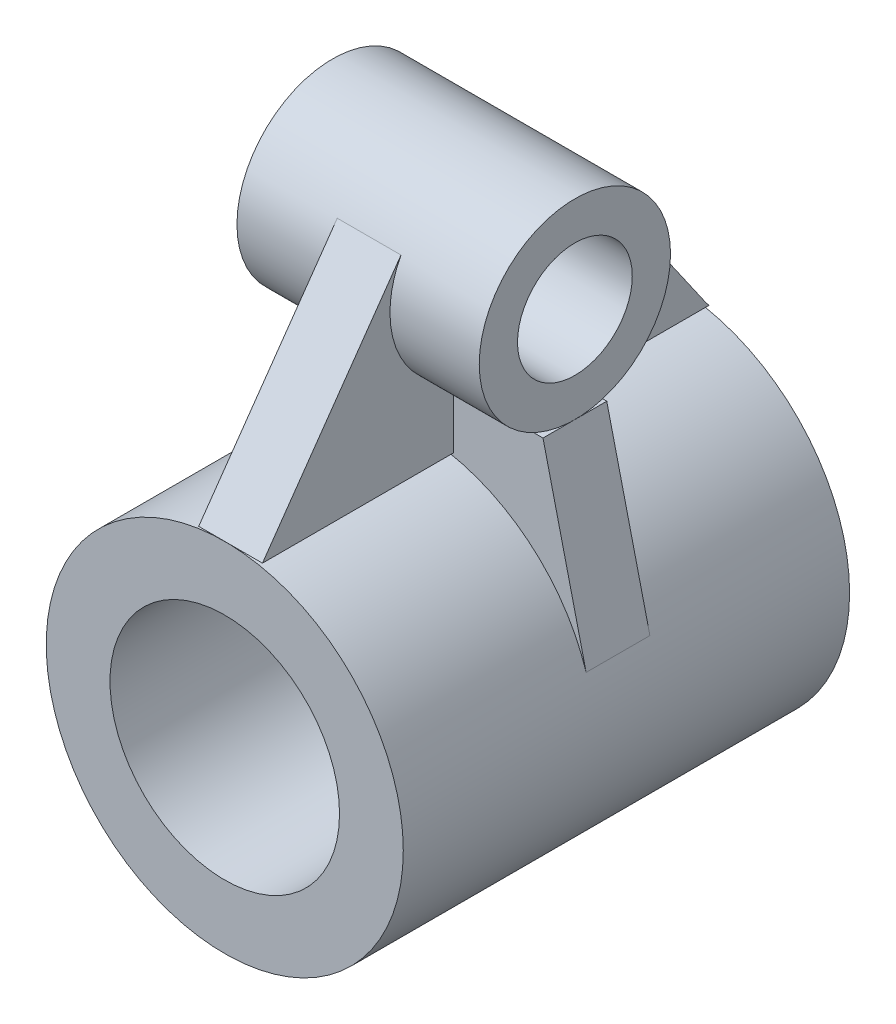
ISO-10303-21;
HEADER;
FILE_DESCRIPTION(('STEP AP214'),'2;1');
FILE_NAME('part.step','',(''),(''),'','','');
FILE_SCHEMA(('AUTOMOTIVE_DESIGN { 1 0 10303 214 1 1 1 1 }'));
ENDSEC;
DATA;
#1=APPLICATION_CONTEXT('core data for automotive mechanical design processes');
#2=APPLICATION_PROTOCOL_DEFINITION('international standard','automotive_design',2000,#1);
#3=PRODUCT_CONTEXT('',#1,'mechanical');
#4=PRODUCT('Part','Part','',(#3));
#5=PRODUCT_RELATED_PRODUCT_CATEGORY('part','',(#4));
#6=PRODUCT_DEFINITION_FORMATION('','',#4);
#7=PRODUCT_DEFINITION_CONTEXT('part definition',#1,'design');
#8=PRODUCT_DEFINITION('design','',#6,#7);
#9=PRODUCT_DEFINITION_SHAPE('','',#8);
#10=(LENGTH_UNIT() NAMED_UNIT(*) SI_UNIT(.MILLI.,.METRE.));
#11=(NAMED_UNIT(*) PLANE_ANGLE_UNIT() SI_UNIT($,.RADIAN.));
#12=(NAMED_UNIT(*) SI_UNIT($,.STERADIAN.) SOLID_ANGLE_UNIT());
#13=UNCERTAINTY_MEASURE_WITH_UNIT(LENGTH_MEASURE(1.E-05),#10,'distance_accuracy_value','');
#14=(GEOMETRIC_REPRESENTATION_CONTEXT(3) GLOBAL_UNCERTAINTY_ASSIGNED_CONTEXT((#13)) GLOBAL_UNIT_ASSIGNED_CONTEXT((#10,
#11,#12)) REPRESENTATION_CONTEXT('',''));
#15=CARTESIAN_POINT('',(0.,0.,0.));
#16=DIRECTION('',(0.,0.,1.));
#17=DIRECTION('',(1.,0.,0.));
#18=AXIS2_PLACEMENT_3D('',#15,#16,#17);
#19=CARTESIAN_POINT('',(1.36388744529317,0.,-15.));
#20=DIRECTION('',(1.,0.,0.));
#21=DIRECTION('',(0.,0.,-1.));
#22=AXIS2_PLACEMENT_3D('',#19,#20,#21);
#23=PLANE('',#22);
#24=DIRECTION('',(0.,-1.,0.));
#25=VECTOR('',#24,1.);
#26=CARTESIAN_POINT('',(1.36388744529317,0.,-20.));
#27=LINE('',#26,#25);
#28=CARTESIAN_POINT('',(1.36388744529317,18.5,-20.));
#29=VERTEX_POINT('',#28);
#30=CARTESIAN_POINT('',(1.36388744529317,14.,-20.));
#31=VERTEX_POINT('',#30);
#32=EDGE_CURVE('E112',#29,#31,#27,.T.);
#33=ORIENTED_EDGE('',*,*,#32,.T.);
#34=DIRECTION('',(0.,0.,-1.));
#35=VECTOR('',#34,1.);
#36=CARTESIAN_POINT('',(1.36388744529317,14.,-15.));
#37=LINE('',#36,#35);
#38=CARTESIAN_POINT('',(1.36388744529317,14.,-15.));
#39=VERTEX_POINT('',#38);
#40=EDGE_CURVE('E12',#39,#31,#37,.T.);
#41=ORIENTED_EDGE('',*,*,#40,.F.);
#42=DIRECTION('',(0.,-1.,0.));
#43=VECTOR('',#42,1.);
#44=CARTESIAN_POINT('',(1.36388744529317,0.,-15.));
#45=LINE('',#44,#43);
#46=CARTESIAN_POINT('',(1.36388744529317,18.5,-15.));
#47=VERTEX_POINT('',#46);
#48=EDGE_CURVE('E97',#47,#39,#45,.T.);
#49=ORIENTED_EDGE('',*,*,#48,.F.);
#50=DIRECTION('',(0.,0.,-1.));
#51=VECTOR('',#50,1.);
#52=CARTESIAN_POINT('',(1.36388744529317,18.5,-15.));
#53=LINE('',#52,#51);
#54=EDGE_CURVE('E108',#47,#29,#53,.T.);
#55=ORIENTED_EDGE('',*,*,#54,.T.);
#56=EDGE_LOOP('',(#33,#41,#49,#55));
#57=FACE_BOUND('',#56,.T.);
#58=ADVANCED_FACE('F50',(#57),#23,.F.);
#59=CARTESIAN_POINT('',(-0.0428078482395226,0.0338572878487188,-15.));
#60=DIRECTION('',(0.,0.,-1.));
#61=DIRECTION('',(-1.,0.,0.));
#62=AXIS2_PLACEMENT_3D('',#59,#60,#61);
#63=CYLINDRICAL_SURFACE('',#62,14.0368063997842);
#64=CARTESIAN_POINT('',(-0.0428078482395226,0.0338572878487188,-20.));
#65=DIRECTION('',(0.,0.,1.));
#66=DIRECTION('',(1.,0.,0.));
#67=AXIS2_PLACEMENT_3D('',#64,#65,#66);
#68=CIRCLE('',#67,14.0368063997842);
#69=CARTESIAN_POINT('',(13.3388115521914,4.2722763477145,-20.));
#70=VERTEX_POINT('',#69);
#71=EDGE_CURVE('E102',#31,#70,#68,.F.);
#72=ORIENTED_EDGE('',*,*,#71,.T.);
#73=DIRECTION('',(0.,0.,-1.));
#74=VECTOR('',#73,1.);
#75=CARTESIAN_POINT('',(13.3388115521914,4.2722763477145,-15.));
#76=LINE('',#75,#74);
#77=CARTESIAN_POINT('',(13.3388115521914,4.2722763477145,-15.));
#78=VERTEX_POINT('',#77);
#79=EDGE_CURVE('E58',#78,#70,#76,.T.);
#80=ORIENTED_EDGE('',*,*,#79,.F.);
#81=CARTESIAN_POINT('',(-0.0428078482395226,0.0338572878487188,-15.));
#82=DIRECTION('',(0.,0.,1.));
#83=DIRECTION('',(1.,0.,0.));
#84=AXIS2_PLACEMENT_3D('',#81,#82,#83);
#85=CIRCLE('',#84,14.0368063997842);
#86=EDGE_CURVE('E92',#39,#78,#85,.F.);
#87=ORIENTED_EDGE('',*,*,#86,.F.);
#88=ORIENTED_EDGE('',*,*,#40,.T.);
#89=EDGE_LOOP('',(#72,#80,#87,#88));
#90=FACE_BOUND('',#89,.T.);
#91=ADVANCED_FACE('F101',(#90),#63,.F.);
#92=CARTESIAN_POINT('',(13.5865932983707,3.23001955943445,-15.));
#93=DIRECTION('',(0.972884952728877,0.23128957770235,0.));
#94=DIRECTION('',(-0.23128957770235,0.972884952728877,0.));
#95=AXIS2_PLACEMENT_3D('',#92,#93,#94);
#96=PLANE('',#95);
#97=DIRECTION('',(0.23128957770235,-0.972884952728877,0.));
#98=VECTOR('',#97,1.);
#99=CARTESIAN_POINT('',(13.5865932983707,3.23001955943445,-20.));
#100=LINE('',#99,#98);
#101=CARTESIAN_POINT('',(9.95637235835603,18.5,-20.));
#102=VERTEX_POINT('',#101);
#103=EDGE_CURVE('E116',#102,#70,#100,.T.);
#104=ORIENTED_EDGE('',*,*,#103,.F.);
#105=DIRECTION('',(0.,0.,-1.));
#106=VECTOR('',#105,1.);
#107=CARTESIAN_POINT('',(9.95637235835603,18.5,-15.));
#108=LINE('',#107,#106);
#109=CARTESIAN_POINT('',(9.95637235835603,18.5,-15.));
#110=VERTEX_POINT('',#109);
#111=EDGE_CURVE('E82',#110,#102,#108,.T.);
#112=ORIENTED_EDGE('',*,*,#111,.F.);
#113=DIRECTION('',(0.23128957770235,-0.972884952728877,0.));
#114=VECTOR('',#113,1.);
#115=CARTESIAN_POINT('',(13.5865932983707,3.23001955943445,-15.));
#116=LINE('',#115,#114);
#117=EDGE_CURVE('E95',#110,#78,#116,.T.);
#118=ORIENTED_EDGE('',*,*,#117,.T.);
#119=ORIENTED_EDGE('',*,*,#79,.T.);
#120=EDGE_LOOP('',(#104,#112,#118,#119));
#121=FACE_BOUND('',#120,.T.);
#122=ADVANCED_FACE('F106',(#121),#96,.T.);
#123=CARTESIAN_POINT('',(0.,18.5,-15.));
#124=DIRECTION('',(0.,-1.,0.));
#125=DIRECTION('',(0.,0.,-1.));
#126=AXIS2_PLACEMENT_3D('',#123,#124,#125);
#127=PLANE('',#126);
#128=DIRECTION('',(-1.,0.,0.));
#129=VECTOR('',#128,1.);
#130=CARTESIAN_POINT('',(0.,18.5,-20.));
#131=LINE('',#130,#129);
#132=EDGE_CURVE('E85',#102,#29,#131,.T.);
#133=ORIENTED_EDGE('',*,*,#132,.T.);
#134=ORIENTED_EDGE('',*,*,#54,.F.);
#135=DIRECTION('',(-1.,0.,0.));
#136=VECTOR('',#135,1.);
#137=CARTESIAN_POINT('',(0.,18.5,-15.));
#138=LINE('',#137,#136);
#139=EDGE_CURVE('E66',#110,#47,#138,.T.);
#140=ORIENTED_EDGE('',*,*,#139,.F.);
#141=ORIENTED_EDGE('',*,*,#111,.T.);
#142=EDGE_LOOP('',(#133,#134,#140,#141));
#143=FACE_BOUND('',#142,.T.);
#144=ADVANCED_FACE('F129',(#143),#127,.F.);
#145=CARTESIAN_POINT('',(0.,0.,-15.));
#146=DIRECTION('',(0.,0.,1.));
#147=DIRECTION('',(1.,0.,0.));
#148=AXIS2_PLACEMENT_3D('',#145,#146,#147);
#149=PLANE('',#148);
#150=ORIENTED_EDGE('',*,*,#48,.T.);
#151=ORIENTED_EDGE('',*,*,#86,.T.);
#152=ORIENTED_EDGE('',*,*,#117,.F.);
#153=ORIENTED_EDGE('',*,*,#139,.T.);
#154=EDGE_LOOP('',(#150,#151,#152,#153));
#155=FACE_BOUND('',#154,.T.);
#156=ADVANCED_FACE('F93',(#155),#149,.T.);
#157=CARTESIAN_POINT('',(0.,0.,-20.));
#158=DIRECTION('',(0.,0.,1.));
#159=DIRECTION('',(1.,0.,0.));
#160=AXIS2_PLACEMENT_3D('',#157,#158,#159);
#161=PLANE('',#160);
#162=ORIENTED_EDGE('',*,*,#32,.F.);
#163=ORIENTED_EDGE('',*,*,#132,.F.);
#164=ORIENTED_EDGE('',*,*,#103,.T.);
#165=ORIENTED_EDGE('',*,*,#71,.F.);
#166=EDGE_LOOP('',(#162,#163,#164,#165));
#167=FACE_BOUND('',#166,.T.);
#168=ADVANCED_FACE('F123',(#167),#161,.F.);
#169=CLOSED_SHELL('',(#58,#91,#122,#144,#156,#168));
#170=MANIFOLD_SOLID_BREP('B2',#169);
#171=CARTESIAN_POINT('',(2.95637235835603,26.,-17.5));
#172=DIRECTION('',(-1.,0.,0.));
#173=DIRECTION('',(0.,0.,1.));
#174=AXIS2_PLACEMENT_3D('',#171,#172,#173);
#175=CYLINDRICAL_SURFACE('',#174,7.5);
#176=DIRECTION('',(-1.,0.,0.));
#177=VECTOR('',#176,1.);
#178=CARTESIAN_POINT('',(2.95637235835603,29.4946097521981,-10.8639090814063));
#179=LINE('',#178,#177);
#180=CARTESIAN_POINT('',(2.95637235835603,29.4946097521981,-10.8639090814063));
#181=VERTEX_POINT('',#180);
#182=CARTESIAN_POINT('',(-2.04362764164397,29.4946097521981,-10.8639090814063));
#183=VERTEX_POINT('',#182);
#184=EDGE_CURVE('E269',#181,#183,#179,.T.);
#185=ORIENTED_EDGE('',*,*,#184,.F.);
#186=CARTESIAN_POINT('',(2.95637235835603,26.,-17.5));
#187=DIRECTION('',(1.,0.,0.));
#188=DIRECTION('',(0.,0.,-1.));
#189=AXIS2_PLACEMENT_3D('',#186,#187,#188);
#190=CIRCLE('',#189,7.5);
#191=CARTESIAN_POINT('',(2.95637235835603,26.,-25.));
#192=VERTEX_POINT('',#191);
#193=EDGE_CURVE('E203',#181,#192,#190,.T.);
#194=ORIENTED_EDGE('',*,*,#193,.T.);
#195=CARTESIAN_POINT('',(2.95637235835603,26.000006044554,-17.5000192684812));
#196=DIRECTION('',(1.,0.,0.));
#197=DIRECTION('',(0.,0.,1.));
#198=AXIS2_PLACEMENT_3D('',#195,#196,#197);
#199=CIRCLE('',#198,7.49998073152119);
#200=CARTESIAN_POINT('',(2.95637235835603,30.2839467605426,-23.6561189196471));
#201=VERTEX_POINT('',#200);
#202=EDGE_CURVE('E312',#192,#201,#199,.T.);
#203=ORIENTED_EDGE('',*,*,#202,.T.);
#204=DIRECTION('',(-1.,0.,0.));
#205=VECTOR('',#204,1.);
#206=CARTESIAN_POINT('',(2.95637235835603,30.2839467605426,-23.6561189196471));
#207=LINE('',#206,#205);
#208=CARTESIAN_POINT('',(-2.04362764164397,30.2839467605426,-23.6561189196471));
#209=VERTEX_POINT('',#208);
#210=EDGE_CURVE('E311',#201,#209,#207,.T.);
#211=ORIENTED_EDGE('',*,*,#210,.T.);
#212=CARTESIAN_POINT('',(-2.04362764164397,26.000006044554,-17.5000192684812));
#213=DIRECTION('',(1.,0.,0.));
#214=DIRECTION('',(0.,0.,1.));
#215=AXIS2_PLACEMENT_3D('',#212,#213,#214);
#216=CIRCLE('',#215,7.49998073152119);
#217=CARTESIAN_POINT('',(-2.04362764164397,26.,-25.));
#218=VERTEX_POINT('',#217);
#219=EDGE_CURVE('E319',#218,#209,#216,.T.);
#220=ORIENTED_EDGE('',*,*,#219,.F.);
#221=CARTESIAN_POINT('',(-2.04362764164397,26.,-17.5));
#222=DIRECTION('',(-1.,0.,0.));
#223=DIRECTION('',(0.,0.,1.));
#224=AXIS2_PLACEMENT_3D('',#221,#222,#223);
#225=CIRCLE('',#224,7.5);
#226=EDGE_CURVE('E280',#218,#183,#225,.T.);
#227=ORIENTED_EDGE('',*,*,#226,.T.);
#228=EDGE_LOOP('',(#185,#194,#203,#211,#220,#227));
#229=FACE_BOUND('',#228,.T.);
#230=CARTESIAN_POINT('',(-9.04362764164397,26.,-17.5));
#231=DIRECTION('',(-1.,0.,0.));
#232=DIRECTION('',(0.,0.,1.));
#233=AXIS2_PLACEMENT_3D('',#230,#231,#232);
#234=CIRCLE('',#233,7.5);
#235=CARTESIAN_POINT('',(-9.04362764164397,26.,-10.));
#236=VERTEX_POINT('',#235);
#237=EDGE_CURVE('E288',#236,#236,#234,.T.);
#238=ORIENTED_EDGE('',*,*,#237,.F.);
#239=EDGE_LOOP('',(#238));
#240=FACE_BOUND('',#239,.T.);
#241=CARTESIAN_POINT('',(9.95637235835603,26.,-17.5));
#242=DIRECTION('',(1.,0.,0.));
#243=DIRECTION('',(0.,0.,-1.));
#244=AXIS2_PLACEMENT_3D('',#241,#242,#243);
#245=CIRCLE('',#244,7.5);
#246=CARTESIAN_POINT('',(9.95637235835603,26.,-25.));
#247=VERTEX_POINT('',#246);
#248=EDGE_CURVE('E324',#247,#247,#245,.T.);
#249=ORIENTED_EDGE('',*,*,#248,.F.);
#250=EDGE_LOOP('',(#249));
#251=FACE_BOUND('',#250,.T.);
#252=ADVANCED_FACE('F195',(#229,#240,#251),#175,.T.);
#253=CARTESIAN_POINT('',(2.95637235835603,26.,-35.));
#254=DIRECTION('',(0.,0.,1.));
#255=DIRECTION('',(1.,0.,0.));
#256=AXIS2_PLACEMENT_3D('',#253,#254,#255);
#257=PLANE('',#256);
#258=DIRECTION('',(-1.,0.,0.));
#259=VECTOR('',#258,1.);
#260=CARTESIAN_POINT('',(2.95637235835603,14.0287474698037,-35.));
#261=LINE('',#260,#259);
#262=CARTESIAN_POINT('',(2.95637235835603,14.0287474698037,-35.));
#263=VERTEX_POINT('',#262);
#264=CARTESIAN_POINT('',(-2.04362764164397,14.0287474698037,-35.));
#265=VERTEX_POINT('',#264);
#266=EDGE_CURVE('E292',#263,#265,#261,.T.);
#267=ORIENTED_EDGE('',*,*,#266,.F.);
#268=DIRECTION('',(0.,-1.,0.));
#269=VECTOR('',#268,1.);
#270=CARTESIAN_POINT('',(2.95637235835603,26.,-35.));
#271=LINE('',#270,#269);
#272=CARTESIAN_POINT('',(2.95637235835603,14.,-35.));
#273=VERTEX_POINT('',#272);
#274=EDGE_CURVE('E275',#263,#273,#271,.T.);
#275=ORIENTED_EDGE('',*,*,#274,.T.);
#276=DIRECTION('',(-1.,0.,0.));
#277=VECTOR('',#276,1.);
#278=CARTESIAN_POINT('',(2.95637235835603,14.,-35.));
#279=LINE('',#278,#277);
#280=CARTESIAN_POINT('',(-2.04362764164397,14.,-35.));
#281=VERTEX_POINT('',#280);
#282=EDGE_CURVE('E274',#273,#281,#279,.T.);
#283=ORIENTED_EDGE('',*,*,#282,.T.);
#284=DIRECTION('',(0.,-1.,0.));
#285=VECTOR('',#284,1.);
#286=CARTESIAN_POINT('',(-2.04362764164397,26.,-35.));
#287=LINE('',#286,#285);
#288=EDGE_CURVE('E277',#265,#281,#287,.T.);
#289=ORIENTED_EDGE('',*,*,#288,.F.);
#290=EDGE_LOOP('',(#267,#275,#283,#289));
#291=FACE_BOUND('',#290,.T.);
#292=ADVANCED_FACE('F197',(#291),#257,.F.);
#293=CARTESIAN_POINT('',(-2.04362764164397,26.,-35.));
#294=DIRECTION('',(1.,0.,0.));
#295=DIRECTION('',(0.,0.,-1.));
#296=AXIS2_PLACEMENT_3D('',#293,#294,#295);
#297=PLANE('',#296);
#298=DIRECTION('',(0.,0.,1.));
#299=VECTOR('',#298,1.);
#300=CARTESIAN_POINT('',(-2.04362764164397,14.,-35.));
#301=LINE('',#300,#299);
#302=CARTESIAN_POINT('',(-2.04362764164396,14.,0.));
#303=VERTEX_POINT('',#302);
#304=EDGE_CURVE('E265',#281,#303,#301,.T.);
#305=ORIENTED_EDGE('',*,*,#304,.T.);
#306=DIRECTION('',(0.,0.81879270251338,-0.574089287751335));
#307=VECTOR('',#306,1.);
#308=CARTESIAN_POINT('',(-2.04362764164396,14.,0.));
#309=LINE('',#308,#307);
#310=EDGE_CURVE('E261',#303,#183,#309,.T.);
#311=ORIENTED_EDGE('',*,*,#310,.T.);
#312=ORIENTED_EDGE('',*,*,#226,.F.);
#313=ORIENTED_EDGE('',*,*,#219,.T.);
#314=DIRECTION('',(0.,-0.820815395603986,-0.571193562935956));
#315=VECTOR('',#314,1.);
#316=CARTESIAN_POINT('',(-2.04362764164397,14.,-34.987881967256));
#317=LINE('',#316,#315);
#318=CARTESIAN_POINT('',(-2.04362764164397,14.2591040493527,-34.8075752065476));
#319=VERTEX_POINT('',#318);
#320=EDGE_CURVE('E210',#209,#319,#317,.T.);
#321=ORIENTED_EDGE('',*,*,#320,.T.);
#322=DIRECTION('',(0.,-0.76746542830542,-0.641090334006042));
#323=VECTOR('',#322,1.);
#324=CARTESIAN_POINT('',(-2.04362764164397,22.9862839195157,-27.5174609531313));
#325=LINE('',#324,#323);
#326=EDGE_CURVE('E293',#319,#265,#325,.T.);
#327=ORIENTED_EDGE('',*,*,#326,.T.);
#328=ORIENTED_EDGE('',*,*,#288,.T.);
#329=EDGE_LOOP('',(#305,#311,#312,#313,#321,#327,#328));
#330=FACE_BOUND('',#329,.T.);
#331=ADVANCED_FACE('F297',(#330),#297,.F.);
#332=CARTESIAN_POINT('',(2.95637235835603,26.,0.));
#333=DIRECTION('',(-1.,0.,0.));
#334=DIRECTION('',(0.,0.,1.));
#335=AXIS2_PLACEMENT_3D('',#332,#333,#334);
#336=PLANE('',#335);
#337=ORIENTED_EDGE('',*,*,#202,.F.);
#338=ORIENTED_EDGE('',*,*,#193,.F.);
#339=DIRECTION('',(0.,0.81879270251338,-0.574089287751335));
#340=VECTOR('',#339,1.);
#341=CARTESIAN_POINT('',(2.95637235835604,14.,0.));
#342=LINE('',#341,#340);
#343=CARTESIAN_POINT('',(2.95637235835604,14.,0.));
#344=VERTEX_POINT('',#343);
#345=EDGE_CURVE('E258',#344,#181,#342,.T.);
#346=ORIENTED_EDGE('',*,*,#345,.F.);
#347=DIRECTION('',(0.,0.,-1.));
#348=VECTOR('',#347,1.);
#349=CARTESIAN_POINT('',(2.95637235835603,14.,0.));
#350=LINE('',#349,#348);
#351=EDGE_CURVE('E217',#344,#273,#350,.T.);
#352=ORIENTED_EDGE('',*,*,#351,.T.);
#353=ORIENTED_EDGE('',*,*,#274,.F.);
#354=DIRECTION('',(0.,-0.76746542830542,-0.641090334006042));
#355=VECTOR('',#354,1.);
#356=CARTESIAN_POINT('',(2.95637235835603,22.9862839195157,-27.5174609531313));
#357=LINE('',#356,#355);
#358=CARTESIAN_POINT('',(2.95637235835603,14.2591040493527,-34.8075752065476));
#359=VERTEX_POINT('',#358);
#360=EDGE_CURVE('E290',#359,#263,#357,.T.);
#361=ORIENTED_EDGE('',*,*,#360,.F.);
#362=DIRECTION('',(0.,-0.820815395603986,-0.571193562935956));
#363=VECTOR('',#362,1.);
#364=CARTESIAN_POINT('',(2.95637235835603,14.,-34.987881967256));
#365=LINE('',#364,#363);
#366=EDGE_CURVE('E302',#201,#359,#365,.T.);
#367=ORIENTED_EDGE('',*,*,#366,.F.);
#368=EDGE_LOOP('',(#337,#338,#346,#352,#353,#361,#367));
#369=FACE_BOUND('',#368,.T.);
#370=ADVANCED_FACE('F267',(#369),#336,.F.);
#371=CARTESIAN_POINT('',(0.,14.,0.));
#372=DIRECTION('',(0.,1.,0.));
#373=DIRECTION('',(0.,0.,1.));
#374=AXIS2_PLACEMENT_3D('',#371,#372,#373);
#375=PLANE('',#374);
#376=ORIENTED_EDGE('',*,*,#282,.F.);
#377=ORIENTED_EDGE('',*,*,#351,.F.);
#378=DIRECTION('',(1.,0.,0.));
#379=VECTOR('',#378,1.);
#380=CARTESIAN_POINT('',(-2.04362764164396,14.,0.));
#381=LINE('',#380,#379);
#382=EDGE_CURVE('E255',#303,#344,#381,.T.);
#383=ORIENTED_EDGE('',*,*,#382,.F.);
#384=ORIENTED_EDGE('',*,*,#304,.F.);
#385=EDGE_LOOP('',(#376,#377,#383,#384));
#386=FACE_BOUND('',#385,.T.);
#387=ADVANCED_FACE('F272',(#386),#375,.F.);
#388=CARTESIAN_POINT('',(2.95637235835603,26.,-17.5));
#389=DIRECTION('',(-1.,0.,0.));
#390=DIRECTION('',(0.,0.,1.));
#391=AXIS2_PLACEMENT_3D('',#388,#389,#390);
#392=CYLINDRICAL_SURFACE('',#391,4.5);
#393=CARTESIAN_POINT('',(-9.04362764164397,26.,-17.5));
#394=DIRECTION('',(-1.,0.,0.));
#395=DIRECTION('',(0.,0.,1.));
#396=AXIS2_PLACEMENT_3D('',#393,#394,#395);
#397=CIRCLE('',#396,4.5);
#398=CARTESIAN_POINT('',(-9.04362764164397,26.,-13.));
#399=VERTEX_POINT('',#398);
#400=EDGE_CURVE('E326',#399,#399,#397,.T.);
#401=ORIENTED_EDGE('',*,*,#400,.T.);
#402=EDGE_LOOP('',(#401));
#403=FACE_BOUND('',#402,.T.);
#404=CARTESIAN_POINT('',(9.95637235835603,26.,-17.5));
#405=DIRECTION('',(1.,0.,0.));
#406=DIRECTION('',(0.,0.,-1.));
#407=AXIS2_PLACEMENT_3D('',#404,#405,#406);
#408=CIRCLE('',#407,4.5);
#409=CARTESIAN_POINT('',(9.95637235835603,26.,-22.));
#410=VERTEX_POINT('',#409);
#411=EDGE_CURVE('E314',#410,#410,#408,.T.);
#412=ORIENTED_EDGE('',*,*,#411,.T.);
#413=EDGE_LOOP('',(#412));
#414=FACE_BOUND('',#413,.T.);
#415=ADVANCED_FACE('F347',(#403,#414),#392,.F.);
#416=CARTESIAN_POINT('',(2.95637235835603,22.9862839195157,-27.5174609531313));
#417=DIRECTION('',(0.,0.641090334006042,-0.76746542830542));
#418=DIRECTION('',(0.,0.76746542830542,0.641090334006042));
#419=AXIS2_PLACEMENT_3D('',#416,#417,#418);
#420=PLANE('',#419);
#421=DIRECTION('',(-1.,0.,0.));
#422=VECTOR('',#421,1.);
#423=CARTESIAN_POINT('',(2.95637235835603,14.2591040493525,-34.8075752065478));
#424=LINE('',#423,#422);
#425=EDGE_CURVE('E48',#359,#319,#424,.T.);
#426=ORIENTED_EDGE('',*,*,#425,.F.);
#427=ORIENTED_EDGE('',*,*,#360,.T.);
#428=ORIENTED_EDGE('',*,*,#266,.T.);
#429=ORIENTED_EDGE('',*,*,#326,.F.);
#430=EDGE_LOOP('',(#426,#427,#428,#429));
#431=FACE_BOUND('',#430,.T.);
#432=ADVANCED_FACE('F306',(#431),#420,.T.);
#433=CARTESIAN_POINT('',(-9.04362764164397,26.,-17.5));
#434=DIRECTION('',(-1.,0.,0.));
#435=DIRECTION('',(0.,0.,1.));
#436=AXIS2_PLACEMENT_3D('',#433,#434,#435);
#437=PLANE('',#436);
#438=ORIENTED_EDGE('',*,*,#237,.T.);
#439=EDGE_LOOP('',(#438));
#440=FACE_BOUND('',#439,.T.);
#441=ORIENTED_EDGE('',*,*,#400,.F.);
#442=EDGE_LOOP('',(#441));
#443=FACE_BOUND('',#442,.T.);
#444=ADVANCED_FACE('F333',(#440,#443),#437,.T.);
#445=CARTESIAN_POINT('',(9.95637235835603,26.,-17.5));
#446=DIRECTION('',(1.,0.,0.));
#447=DIRECTION('',(0.,0.,-1.));
#448=AXIS2_PLACEMENT_3D('',#445,#446,#447);
#449=PLANE('',#448);
#450=ORIENTED_EDGE('',*,*,#248,.T.);
#451=EDGE_LOOP('',(#450));
#452=FACE_BOUND('',#451,.T.);
#453=ORIENTED_EDGE('',*,*,#411,.F.);
#454=EDGE_LOOP('',(#453));
#455=FACE_BOUND('',#454,.T.);
#456=ADVANCED_FACE('F341',(#452,#455),#449,.T.);
#457=CARTESIAN_POINT('',(2.95637235835603,14.,-34.987881967256));
#458=DIRECTION('',(0.,0.571193562935956,-0.820815395603986));
#459=DIRECTION('',(0.,0.820815395603986,0.571193562935956));
#460=AXIS2_PLACEMENT_3D('',#457,#458,#459);
#461=PLANE('',#460);
#462=ORIENTED_EDGE('',*,*,#366,.T.);
#463=ORIENTED_EDGE('',*,*,#425,.T.);
#464=ORIENTED_EDGE('',*,*,#320,.F.);
#465=ORIENTED_EDGE('',*,*,#210,.F.);
#466=EDGE_LOOP('',(#462,#463,#464,#465));
#467=FACE_BOUND('',#466,.T.);
#468=ADVANCED_FACE('F309',(#467),#461,.T.);
#469=CARTESIAN_POINT('',(2.95637235835604,14.,0.));
#470=DIRECTION('',(0.,0.574089287751335,0.81879270251338));
#471=DIRECTION('',(0.,-0.81879270251338,0.574089287751335));
#472=AXIS2_PLACEMENT_3D('',#469,#470,#471);
#473=PLANE('',#472);
#474=ORIENTED_EDGE('',*,*,#310,.F.);
#475=ORIENTED_EDGE('',*,*,#382,.T.);
#476=ORIENTED_EDGE('',*,*,#345,.T.);
#477=ORIENTED_EDGE('',*,*,#184,.T.);
#478=EDGE_LOOP('',(#474,#475,#476,#477));
#479=FACE_BOUND('',#478,.T.);
#480=ADVANCED_FACE('F256',(#479),#473,.T.);
#481=CLOSED_SHELL('',(#252,#292,#331,#370,#387,#415,#432,#444,#456,#468,#480));
#482=MANIFOLD_SOLID_BREP('B6',#481);
#483=CARTESIAN_POINT('',(0.,0.,-35.));
#484=DIRECTION('',(0.,0.,1.));
#485=DIRECTION('',(1.,0.,0.));
#486=AXIS2_PLACEMENT_3D('',#483,#484,#485);
#487=CYLINDRICAL_SURFACE('',#486,14.);
#488=CARTESIAN_POINT('',(0.,0.,-15.));
#489=DIRECTION('',(0.,0.,1.));
#490=DIRECTION('',(1.,0.,0.));
#491=AXIS2_PLACEMENT_3D('',#488,#489,#490);
#492=CIRCLE('',#491,14.);
#493=CARTESIAN_POINT('',(-12.8458083773829,5.56643576551105,-15.));
#494=VERTEX_POINT('',#493);
#495=CARTESIAN_POINT('',(-2.26009040766938,13.8163667926543,-15.));
#496=VERTEX_POINT('',#495);
#497=EDGE_CURVE('E193',#494,#496,#492,.F.);
#498=ORIENTED_EDGE('',*,*,#497,.F.);
#499=DIRECTION('',(0.,0.,1.));
#500=VECTOR('',#499,1.);
#501=CARTESIAN_POINT('',(-12.8458083773829,5.56643576551103,-35.));
#502=LINE('',#501,#500);
#503=CARTESIAN_POINT('',(-12.8458083773829,5.56643576551105,-20.));
#504=VERTEX_POINT('',#503);
#505=EDGE_CURVE('E508',#494,#504,#502,.F.);
#506=ORIENTED_EDGE('',*,*,#505,.T.);
#507=CARTESIAN_POINT('',(0.,0.,-20.));
#508=DIRECTION('',(0.,0.,1.));
#509=DIRECTION('',(1.,0.,0.));
#510=AXIS2_PLACEMENT_3D('',#507,#508,#509);
#511=CIRCLE('',#510,14.);
#512=CARTESIAN_POINT('',(-2.26009040766938,13.8163667926543,-20.));
#513=VERTEX_POINT('',#512);
#514=EDGE_CURVE('E590',#504,#513,#511,.F.);
#515=ORIENTED_EDGE('',*,*,#514,.T.);
#516=DIRECTION('',(0.,0.,-1.));
#517=VECTOR('',#516,1.);
#518=CARTESIAN_POINT('',(-2.26009040766938,13.8163667926543,-17.5));
#519=LINE('',#518,#517);
#520=EDGE_CURVE('E595',#513,#496,#519,.F.);
#521=ORIENTED_EDGE('',*,*,#520,.T.);
#522=EDGE_LOOP('',(#498,#506,#515,#521));
#523=FACE_BOUND('',#522,.T.);
#524=CARTESIAN_POINT('',(0.,0.,-35.));
#525=DIRECTION('',(0.,0.,1.));
#526=DIRECTION('',(1.,0.,0.));
#527=AXIS2_PLACEMENT_3D('',#524,#525,#526);
#528=CIRCLE('',#527,14.);
#529=CARTESIAN_POINT('',(14.,0.,-35.));
#530=VERTEX_POINT('',#529);
#531=EDGE_CURVE('E587',#530,#530,#528,.T.);
#532=ORIENTED_EDGE('',*,*,#531,.T.);
#533=EDGE_LOOP('',(#532));
#534=FACE_BOUND('',#533,.T.);
#535=CARTESIAN_POINT('',(0.,0.,0.));
#536=DIRECTION('',(0.,0.,1.));
#537=DIRECTION('',(1.,0.,0.));
#538=AXIS2_PLACEMENT_3D('',#535,#536,#537);
#539=CIRCLE('',#538,14.);
#540=CARTESIAN_POINT('',(14.,0.,0.));
#541=VERTEX_POINT('',#540);
#542=EDGE_CURVE('E584',#541,#541,#539,.T.);
#543=ORIENTED_EDGE('',*,*,#542,.F.);
#544=EDGE_LOOP('',(#543));
#545=FACE_BOUND('',#544,.T.);
#546=ADVANCED_FACE('F501',(#523,#534,#545),#487,.T.);
#547=CARTESIAN_POINT('',(0.,0.,-35.));
#548=DIRECTION('',(0.,0.,1.));
#549=DIRECTION('',(1.,0.,0.));
#550=AXIS2_PLACEMENT_3D('',#547,#548,#549);
#551=PLANE('',#550);
#552=CARTESIAN_POINT('',(0.,0.,-35.));
#553=DIRECTION('',(0.,0.,1.));
#554=DIRECTION('',(1.,0.,0.));
#555=AXIS2_PLACEMENT_3D('',#552,#553,#554);
#556=CIRCLE('',#555,9.);
#557=CARTESIAN_POINT('',(9.,0.,-35.));
#558=VERTEX_POINT('',#557);
#559=EDGE_CURVE('E581',#558,#558,#556,.T.);
#560=ORIENTED_EDGE('',*,*,#559,.T.);
#561=EDGE_LOOP('',(#560));
#562=FACE_BOUND('',#561,.T.);
#563=ORIENTED_EDGE('',*,*,#531,.F.);
#564=EDGE_LOOP('',(#563));
#565=FACE_BOUND('',#564,.T.);
#566=ADVANCED_FACE('F615',(#562,#565),#551,.F.);
#567=CARTESIAN_POINT('',(0.,0.,0.));
#568=DIRECTION('',(0.,0.,1.));
#569=DIRECTION('',(1.,0.,0.));
#570=AXIS2_PLACEMENT_3D('',#567,#568,#569);
#571=PLANE('',#570);
#572=CARTESIAN_POINT('',(0.,0.,0.));
#573=DIRECTION('',(0.,0.,1.));
#574=DIRECTION('',(1.,0.,0.));
#575=AXIS2_PLACEMENT_3D('',#572,#573,#574);
#576=CIRCLE('',#575,9.);
#577=CARTESIAN_POINT('',(9.,0.,0.));
#578=VERTEX_POINT('',#577);
#579=EDGE_CURVE('E560',#578,#578,#576,.T.);
#580=ORIENTED_EDGE('',*,*,#579,.F.);
#581=EDGE_LOOP('',(#580));
#582=FACE_BOUND('',#581,.T.);
#583=ORIENTED_EDGE('',*,*,#542,.T.);
#584=EDGE_LOOP('',(#583));
#585=FACE_BOUND('',#584,.T.);
#586=ADVANCED_FACE('F619',(#582,#585),#571,.T.);
#587=CARTESIAN_POINT('',(0.,0.,-35.));
#588=DIRECTION('',(0.,0.,1.));
#589=DIRECTION('',(1.,0.,0.));
#590=AXIS2_PLACEMENT_3D('',#587,#588,#589);
#591=CYLINDRICAL_SURFACE('',#590,9.);
#592=ORIENTED_EDGE('',*,*,#559,.F.);
#593=EDGE_LOOP('',(#592));
#594=FACE_BOUND('',#593,.T.);
#595=ORIENTED_EDGE('',*,*,#579,.T.);
#596=EDGE_LOOP('',(#595));
#597=FACE_BOUND('',#596,.T.);
#598=ADVANCED_FACE('F625',(#594,#597),#591,.F.);
#599=CARTESIAN_POINT('',(-13.3301832064719,3.91877790782241,-15.));
#600=DIRECTION('',(0.959401813882037,-0.282042832775196,0.));
#601=DIRECTION('',(0.282042832775196,0.959401813882037,0.));
#602=AXIS2_PLACEMENT_3D('',#599,#600,#601);
#603=PLANE('',#602);
#604=ORIENTED_EDGE('',*,*,#505,.F.);
#605=DIRECTION('',(-0.282042832775196,-0.959401813882037,0.));
#606=VECTOR('',#605,1.);
#607=CARTESIAN_POINT('',(-13.3301832064719,3.91877790782241,-15.));
#608=LINE('',#607,#606);
#609=CARTESIAN_POINT('',(-9.04362764164397,18.5,-15.));
#610=VERTEX_POINT('',#609);
#611=EDGE_CURVE('E553',#610,#494,#608,.T.);
#612=ORIENTED_EDGE('',*,*,#611,.F.);
#613=DIRECTION('',(0.,0.,-1.));
#614=VECTOR('',#613,1.);
#615=CARTESIAN_POINT('',(-9.04362764164397,18.5,-15.));
#616=LINE('',#615,#614);
#617=CARTESIAN_POINT('',(-9.04362764164397,18.5,-20.));
#618=VERTEX_POINT('',#617);
#619=EDGE_CURVE('E566',#610,#618,#616,.T.);
#620=ORIENTED_EDGE('',*,*,#619,.T.);
#621=DIRECTION('',(-0.282042832775196,-0.959401813882037,0.));
#622=VECTOR('',#621,1.);
#623=CARTESIAN_POINT('',(-13.3301832064719,3.91877790782241,-20.));
#624=LINE('',#623,#622);
#625=EDGE_CURVE('E570',#618,#504,#624,.T.);
#626=ORIENTED_EDGE('',*,*,#625,.T.);
#627=EDGE_LOOP('',(#604,#612,#620,#626));
#628=FACE_BOUND('',#627,.T.);
#629=ADVANCED_FACE('F601',(#628),#603,.F.);
#630=CARTESIAN_POINT('',(0.266168402588377,-0.266380984301389,-15.));
#631=DIRECTION('',(0.,0.,-1.));
#632=DIRECTION('',(-1.,0.,0.));
#633=AXIS2_PLACEMENT_3D('',#630,#631,#632);
#634=CYLINDRICAL_SURFACE('',#633,14.307542364982);
#635=ORIENTED_EDGE('',*,*,#520,.F.);
#636=CARTESIAN_POINT('',(0.266168402588377,-0.266380984301389,-20.));
#637=DIRECTION('',(0.,0.,1.));
#638=DIRECTION('',(1.,0.,0.));
#639=AXIS2_PLACEMENT_3D('',#636,#637,#638);
#640=CIRCLE('',#639,14.307542364982);
#641=CARTESIAN_POINT('',(-0.8183324671759,14.,-20.));
#642=VERTEX_POINT('',#641);
#643=EDGE_CURVE('E515',#513,#642,#640,.F.);
#644=ORIENTED_EDGE('',*,*,#643,.T.);
#645=DIRECTION('',(0.,0.,-1.));
#646=VECTOR('',#645,1.);
#647=CARTESIAN_POINT('',(-0.8183324671759,14.,-15.));
#648=LINE('',#647,#646);
#649=CARTESIAN_POINT('',(-0.8183324671759,14.,-15.));
#650=VERTEX_POINT('',#649);
#651=EDGE_CURVE('E556',#650,#642,#648,.T.);
#652=ORIENTED_EDGE('',*,*,#651,.F.);
#653=CARTESIAN_POINT('',(0.266168402588377,-0.266380984301389,-15.));
#654=DIRECTION('',(0.,0.,1.));
#655=DIRECTION('',(1.,0.,0.));
#656=AXIS2_PLACEMENT_3D('',#653,#654,#655);
#657=CIRCLE('',#656,14.307542364982);
#658=EDGE_CURVE('E544',#496,#650,#657,.F.);
#659=ORIENTED_EDGE('',*,*,#658,.F.);
#660=EDGE_LOOP('',(#635,#644,#652,#659));
#661=FACE_BOUND('',#660,.T.);
#662=ADVANCED_FACE('F557',(#661),#634,.F.);
#663=CARTESIAN_POINT('',(-0.8183324671759,0.,-15.));
#664=DIRECTION('',(1.,0.,0.));
#665=DIRECTION('',(0.,0.,-1.));
#666=AXIS2_PLACEMENT_3D('',#663,#664,#665);
#667=PLANE('',#666);
#668=DIRECTION('',(0.,-1.,0.));
#669=VECTOR('',#668,1.);
#670=CARTESIAN_POINT('',(-0.8183324671759,0.,-20.));
#671=LINE('',#670,#669);
#672=CARTESIAN_POINT('',(-0.8183324671759,18.5,-20.));
#673=VERTEX_POINT('',#672);
#674=EDGE_CURVE('E574',#673,#642,#671,.T.);
#675=ORIENTED_EDGE('',*,*,#674,.F.);
#676=DIRECTION('',(0.,0.,-1.));
#677=VECTOR('',#676,1.);
#678=CARTESIAN_POINT('',(-0.8183324671759,18.5,-15.));
#679=LINE('',#678,#677);
#680=CARTESIAN_POINT('',(-0.8183324671759,18.5,-15.));
#681=VERTEX_POINT('',#680);
#682=EDGE_CURVE('E561',#681,#673,#679,.T.);
#683=ORIENTED_EDGE('',*,*,#682,.F.);
#684=DIRECTION('',(0.,-1.,0.));
#685=VECTOR('',#684,1.);
#686=CARTESIAN_POINT('',(-0.8183324671759,0.,-15.));
#687=LINE('',#686,#685);
#688=EDGE_CURVE('E549',#681,#650,#687,.T.);
#689=ORIENTED_EDGE('',*,*,#688,.T.);
#690=ORIENTED_EDGE('',*,*,#651,.T.);
#691=EDGE_LOOP('',(#675,#683,#689,#690));
#692=FACE_BOUND('',#691,.T.);
#693=ADVANCED_FACE('F563',(#692),#667,.T.);
#694=CARTESIAN_POINT('',(0.,18.5,-15.));
#695=DIRECTION('',(0.,1.,0.));
#696=DIRECTION('',(0.,0.,1.));
#697=AXIS2_PLACEMENT_3D('',#694,#695,#696);
#698=PLANE('',#697);
#699=DIRECTION('',(1.,0.,0.));
#700=VECTOR('',#699,1.);
#701=CARTESIAN_POINT('',(0.,18.5,-20.));
#702=LINE('',#701,#700);
#703=EDGE_CURVE('E576',#618,#673,#702,.T.);
#704=ORIENTED_EDGE('',*,*,#703,.F.);
#705=ORIENTED_EDGE('',*,*,#619,.F.);
#706=DIRECTION('',(1.,0.,0.));
#707=VECTOR('',#706,1.);
#708=CARTESIAN_POINT('',(0.,18.5,-15.));
#709=LINE('',#708,#707);
#710=EDGE_CURVE('E564',#610,#681,#709,.T.);
#711=ORIENTED_EDGE('',*,*,#710,.T.);
#712=ORIENTED_EDGE('',*,*,#682,.T.);
#713=EDGE_LOOP('',(#704,#705,#711,#712));
#714=FACE_BOUND('',#713,.T.);
#715=ADVANCED_FACE('F605',(#714),#698,.T.);
#716=CARTESIAN_POINT('',(0.,0.,-15.));
#717=DIRECTION('',(0.,0.,1.));
#718=DIRECTION('',(1.,0.,0.));
#719=AXIS2_PLACEMENT_3D('',#716,#717,#718);
#720=PLANE('',#719);
#721=ORIENTED_EDGE('',*,*,#611,.T.);
#722=ORIENTED_EDGE('',*,*,#497,.T.);
#723=ORIENTED_EDGE('',*,*,#658,.T.);
#724=ORIENTED_EDGE('',*,*,#688,.F.);
#725=ORIENTED_EDGE('',*,*,#710,.F.);
#726=EDGE_LOOP('',(#721,#722,#723,#724,#725));
#727=FACE_BOUND('',#726,.T.);
#728=ADVANCED_FACE('F546',(#727),#720,.T.);
#729=CARTESIAN_POINT('',(0.,0.,-20.));
#730=DIRECTION('',(0.,0.,1.));
#731=DIRECTION('',(1.,0.,0.));
#732=AXIS2_PLACEMENT_3D('',#729,#730,#731);
#733=PLANE('',#732);
#734=ORIENTED_EDGE('',*,*,#514,.F.);
#735=ORIENTED_EDGE('',*,*,#625,.F.);
#736=ORIENTED_EDGE('',*,*,#703,.T.);
#737=ORIENTED_EDGE('',*,*,#674,.T.);
#738=ORIENTED_EDGE('',*,*,#643,.F.);
#739=EDGE_LOOP('',(#734,#735,#736,#737,#738));
#740=FACE_BOUND('',#739,.T.);
#741=ADVANCED_FACE('F606',(#740),#733,.F.);
#742=CLOSED_SHELL('',(#546,#566,#586,#598,#629,#662,#693,#715,#728,#741));
#743=MANIFOLD_SOLID_BREP('B42',#742);
#744=ADVANCED_BREP_SHAPE_REPRESENTATION('',(#18,#170,#482,#743),#14);
#745=SHAPE_DEFINITION_REPRESENTATION(#9,#744);
ENDSEC;
END-ISO-10303-21;
